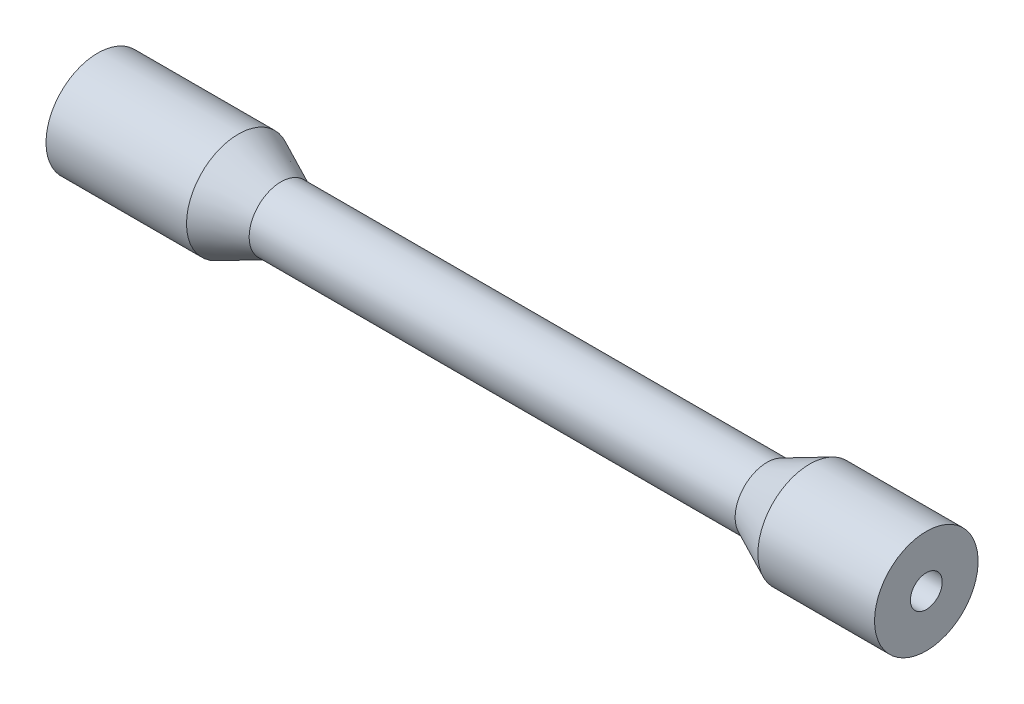
ISO-10303-21;
HEADER;
FILE_DESCRIPTION(('STEP AP214'),'2;1');
FILE_NAME('part.step','',(''),(''),'','','');
FILE_SCHEMA(('AUTOMOTIVE_DESIGN { 1 0 10303 214 1 1 1 1 }'));
ENDSEC;
DATA;
#1=APPLICATION_CONTEXT('core data for automotive mechanical design processes');
#2=APPLICATION_PROTOCOL_DEFINITION('international standard','automotive_design',2000,#1);
#3=PRODUCT_CONTEXT('',#1,'mechanical');
#4=PRODUCT('Part','Part','',(#3));
#5=PRODUCT_RELATED_PRODUCT_CATEGORY('part','',(#4));
#6=PRODUCT_DEFINITION_FORMATION('','',#4);
#7=PRODUCT_DEFINITION_CONTEXT('part definition',#1,'design');
#8=PRODUCT_DEFINITION('design','',#6,#7);
#9=PRODUCT_DEFINITION_SHAPE('','',#8);
#10=(LENGTH_UNIT() NAMED_UNIT(*) SI_UNIT(.MILLI.,.METRE.));
#11=(NAMED_UNIT(*) PLANE_ANGLE_UNIT() SI_UNIT($,.RADIAN.));
#12=(NAMED_UNIT(*) SI_UNIT($,.STERADIAN.) SOLID_ANGLE_UNIT());
#13=UNCERTAINTY_MEASURE_WITH_UNIT(LENGTH_MEASURE(1.E-05),#10,'distance_accuracy_value','');
#14=(GEOMETRIC_REPRESENTATION_CONTEXT(3) GLOBAL_UNCERTAINTY_ASSIGNED_CONTEXT((#13)) GLOBAL_UNIT_ASSIGNED_CONTEXT((#10,
#11,#12)) REPRESENTATION_CONTEXT('',''));
#15=CARTESIAN_POINT('',(0.,0.,0.));
#16=DIRECTION('',(0.,0.,1.));
#17=DIRECTION('',(1.,0.,0.));
#18=AXIS2_PLACEMENT_3D('',#15,#16,#17);
#19=CARTESIAN_POINT('',(52.,0.,0.));
#20=DIRECTION('',(-1.,0.,0.));
#21=DIRECTION('',(0.,0.,1.));
#22=AXIS2_PLACEMENT_3D('',#19,#20,#21);
#23=CYLINDRICAL_SURFACE('',#22,3.25);
#24=CARTESIAN_POINT('',(0.,0.,0.));
#25=DIRECTION('',(1.,0.,0.));
#26=DIRECTION('',(0.,0.,-1.));
#27=AXIS2_PLACEMENT_3D('',#24,#25,#26);
#28=CIRCLE('',#27,3.25);
#29=CARTESIAN_POINT('',(0.,0.,3.25));
#30=VERTEX_POINT('',#29);
#31=EDGE_CURVE('E46',#30,#30,#28,.T.);
#32=CARTESIAN_POINT('',(8.81936634936306,0.,0.));
#33=DIRECTION('',(-1.,0.,0.));
#34=DIRECTION('',(0.,0.,1.));
#35=AXIS2_PLACEMENT_3D('',#32,#33,#34);
#36=CIRCLE('',#35,3.25);
#37=CARTESIAN_POINT('',(8.81936634936306,0.,3.25));
#38=VERTEX_POINT('',#37);
#39=EDGE_CURVE('E61',#38,#38,#36,.T.);
#40=CARTESIAN_POINT('',(0.,0.,3.25));
#41=CARTESIAN_POINT('',(0.091868399472531,0.,3.25));
#42=CARTESIAN_POINT('',(0.183736798945062,0.,3.25));
#43=CARTESIAN_POINT('',(0.367473597890126,0.,3.25));
#44=CARTESIAN_POINT('',(0.45934199736266,0.,3.25));
#45=CARTESIAN_POINT('',(0.643078796307724,0.,3.25));
#46=CARTESIAN_POINT('',(0.734947195780255,0.,3.25));
#47=CARTESIAN_POINT('',(0.918683994725319,0.,3.25));
#48=CARTESIAN_POINT('',(1.01055239419785,0.,3.25));
#49=CARTESIAN_POINT('',(1.19428919314292,0.,3.25));
#50=CARTESIAN_POINT('',(1.28615759261545,0.,3.25));
#51=CARTESIAN_POINT('',(1.46989439156051,0.,3.25));
#52=CARTESIAN_POINT('',(1.56176279103304,0.,3.25));
#53=CARTESIAN_POINT('',(1.74549958997811,0.,3.25));
#54=CARTESIAN_POINT('',(1.83736798945064,0.,3.25));
#55=CARTESIAN_POINT('',(2.0211047883957,0.,3.25));
#56=CARTESIAN_POINT('',(2.11297318786823,0.,3.25));
#57=CARTESIAN_POINT('',(2.2967099868133,0.,3.25));
#58=CARTESIAN_POINT('',(2.38857838628583,0.,3.25));
#59=CARTESIAN_POINT('',(2.57231518523089,0.,3.25));
#60=CARTESIAN_POINT('',(2.66418358470343,0.,3.25));
#61=CARTESIAN_POINT('',(2.84792038364849,0.,3.25));
#62=CARTESIAN_POINT('',(2.93978878312102,0.,3.25));
#63=CARTESIAN_POINT('',(3.12352558206608,0.,3.25));
#64=CARTESIAN_POINT('',(3.21539398153861,0.,3.25));
#65=CARTESIAN_POINT('',(3.39913078048368,0.,3.25));
#66=CARTESIAN_POINT('',(3.49099917995621,0.,3.25));
#67=CARTESIAN_POINT('',(3.67473597890128,0.,3.25));
#68=CARTESIAN_POINT('',(3.76660437837381,0.,3.25));
#69=CARTESIAN_POINT('',(3.95034117731887,0.,3.25));
#70=CARTESIAN_POINT('',(4.0422095767914,0.,3.25));
#71=CARTESIAN_POINT('',(4.22594637573647,0.,3.25));
#72=CARTESIAN_POINT('',(4.317814775209,0.,3.25));
#73=CARTESIAN_POINT('',(4.50155157415406,0.,3.25));
#74=CARTESIAN_POINT('',(4.59341997362659,0.,3.25));
#75=CARTESIAN_POINT('',(4.77715677257166,0.,3.25));
#76=CARTESIAN_POINT('',(4.86902517204419,0.,3.25));
#77=CARTESIAN_POINT('',(5.05276197098925,0.,3.25));
#78=CARTESIAN_POINT('',(5.14463037046179,0.,3.25));
#79=CARTESIAN_POINT('',(5.32836716940685,0.,3.25));
#80=CARTESIAN_POINT('',(5.42023556887938,0.,3.25));
#81=CARTESIAN_POINT('',(5.60397236782445,0.,3.25));
#82=CARTESIAN_POINT('',(5.69584076729698,0.,3.25));
#83=CARTESIAN_POINT('',(5.87957756624204,0.,3.25));
#84=CARTESIAN_POINT('',(5.97144596571457,0.,3.25));
#85=CARTESIAN_POINT('',(6.15518276465964,0.,3.25));
#86=CARTESIAN_POINT('',(6.24705116413217,0.,3.25));
#87=CARTESIAN_POINT('',(6.43078796307723,0.,3.25));
#88=CARTESIAN_POINT('',(6.52265636254976,0.,3.25));
#89=CARTESIAN_POINT('',(6.70639316149483,0.,3.25));
#90=CARTESIAN_POINT('',(6.79826156096736,0.,3.25));
#91=CARTESIAN_POINT('',(6.98199835991242,0.,3.25));
#92=CARTESIAN_POINT('',(7.07386675938496,0.,3.25));
#93=CARTESIAN_POINT('',(7.25760355833002,0.,3.25));
#94=CARTESIAN_POINT('',(7.34947195780255,0.,3.25));
#95=CARTESIAN_POINT('',(7.53320875674761,0.,3.25));
#96=CARTESIAN_POINT('',(7.62507715622014,0.,3.25));
#97=CARTESIAN_POINT('',(7.80881395516521,0.,3.25));
#98=CARTESIAN_POINT('',(7.90068235463774,0.,3.25));
#99=CARTESIAN_POINT('',(8.08441915358281,0.,3.25));
#100=CARTESIAN_POINT('',(8.17628755305534,0.,3.25));
#101=CARTESIAN_POINT('',(8.3600243520004,0.,3.25));
#102=CARTESIAN_POINT('',(8.45189275147293,0.,3.25));
#103=CARTESIAN_POINT('',(8.635629550418,0.,3.25));
#104=CARTESIAN_POINT('',(8.72749794989053,0.,3.25));
#105=CARTESIAN_POINT('',(8.81936634936306,0.,3.25));
#106=B_SPLINE_CURVE_WITH_KNOTS('',3,(#40,#41,#42,#43,#44,#45,#46,#47,#48,#49,#50,#51,#52,#53,
#54,#55,#56,#57,#58,#59,#60,#61,#62,#63,#64,#65,#66,#67,#68,#69,#70,#71,#72,#73,#74,#75,#76,#77,
#78,#79,#80,#81,#82,#83,#84,#85,#86,#87,#88,#89,#90,#91,#92,#93,#94,#95,#96,#97,#98,#99,#100,
#101,#102,#103,#104,#105),.UNSPECIFIED.,.F.,.F.,(4,2,2,2,2,2,2,2,2,2,2,2,2,2,2,2,2,2,2,2,2,2,2,
2,2,2,2,2,2,2,2,2,4),(0.,0.275605198417593,0.551210396835193,0.826815595252786,1.10242079367039,
1.37802599208798,1.65363119050557,1.92923638892317,2.20484158734077,2.48044678575836,
2.75605198417596,3.03165718259355,3.30726238101114,3.58286757942874,3.85847277784634,
4.13407797626394,4.40968317468153,4.68528837309912,4.96089357151672,5.23649876993432,
5.51210396835192,5.78770916676951,6.0633143651871,6.3389195636047,6.6145247620223,
6.89012996043989,7.16573515885749,7.44134035727508,7.71694555569267,7.99255075411028,
8.26815595252787,8.54376115094546,8.81936634936306),.UNSPECIFIED.);
#107=EDGE_CURVE('BSEAM43',#30,#38,#106,.T.);
#108=ORIENTED_EDGE('',*,*,#31,.T.);
#109=ORIENTED_EDGE('',*,*,#39,.T.);
#110=ORIENTED_EDGE('',*,*,#107,.T.);
#111=ORIENTED_EDGE('',*,*,#107,.F.);
#112=EDGE_LOOP('',(#108,#110,#109,#111));
#113=FACE_BOUND('',#112,.T.);
#114=ADVANCED_FACE('F43',(#113),#23,.T.);
#115=CARTESIAN_POINT('',(52.,0.,0.));
#116=DIRECTION('',(1.,0.,0.));
#117=DIRECTION('',(0.,0.,-1.));
#118=AXIS2_PLACEMENT_3D('',#115,#116,#117);
#119=CIRCLE('',#118,3.25);
#120=CARTESIAN_POINT('',(52.,0.,3.25));
#121=VERTEX_POINT('',#120);
#122=EDGE_CURVE('E10',#121,#121,#119,.T.);
#123=CARTESIAN_POINT('',(44.6806336506369,0.,0.));
#124=DIRECTION('',(-1.,0.,0.));
#125=DIRECTION('',(0.,0.,1.));
#126=AXIS2_PLACEMENT_3D('',#123,#124,#125);
#127=CIRCLE('',#126,3.25);
#128=CARTESIAN_POINT('',(44.6806336506369,0.,3.25));
#129=VERTEX_POINT('',#128);
#130=EDGE_CURVE('E76',#129,#129,#127,.T.);
#131=CARTESIAN_POINT('',(52.,0.,3.25));
#132=CARTESIAN_POINT('',(51.9237566005275,0.,3.25));
#133=CARTESIAN_POINT('',(51.8475132010549,0.,3.25));
#134=CARTESIAN_POINT('',(51.6950264021099,0.,3.25));
#135=CARTESIAN_POINT('',(51.6187830026373,0.,3.25));
#136=CARTESIAN_POINT('',(51.4662962036923,0.,3.25));
#137=CARTESIAN_POINT('',(51.3900528042197,0.,3.25));
#138=CARTESIAN_POINT('',(51.2375660052747,0.,3.25));
#139=CARTESIAN_POINT('',(51.1613226058021,0.,3.25));
#140=CARTESIAN_POINT('',(51.0088358068571,0.,3.25));
#141=CARTESIAN_POINT('',(50.9325924073845,0.,3.25));
#142=CARTESIAN_POINT('',(50.7801056084395,0.,3.25));
#143=CARTESIAN_POINT('',(50.703862208967,0.,3.25));
#144=CARTESIAN_POINT('',(50.5513754100219,0.,3.25));
#145=CARTESIAN_POINT('',(50.4751320105494,0.,3.25));
#146=CARTESIAN_POINT('',(50.3226452116043,0.,3.25));
#147=CARTESIAN_POINT('',(50.2464018121318,0.,3.25));
#148=CARTESIAN_POINT('',(50.0939150131867,0.,3.25));
#149=CARTESIAN_POINT('',(50.0176716137142,0.,3.25));
#150=CARTESIAN_POINT('',(49.8651848147691,0.,3.25));
#151=CARTESIAN_POINT('',(49.7889414152966,0.,3.25));
#152=CARTESIAN_POINT('',(49.6364546163515,0.,3.25));
#153=CARTESIAN_POINT('',(49.560211216879,0.,3.25));
#154=CARTESIAN_POINT('',(49.4077244179339,0.,3.25));
#155=CARTESIAN_POINT('',(49.3314810184614,0.,3.25));
#156=CARTESIAN_POINT('',(49.1789942195163,0.,3.25));
#157=CARTESIAN_POINT('',(49.1027508200438,0.,3.25));
#158=CARTESIAN_POINT('',(48.9502640210987,0.,3.25));
#159=CARTESIAN_POINT('',(48.8740206216262,0.,3.25));
#160=CARTESIAN_POINT('',(48.7215338226811,0.,3.25));
#161=CARTESIAN_POINT('',(48.6452904232086,0.,3.25));
#162=CARTESIAN_POINT('',(48.4928036242635,0.,3.25));
#163=CARTESIAN_POINT('',(48.416560224791,0.,3.25));
#164=CARTESIAN_POINT('',(48.2640734258459,0.,3.25));
#165=CARTESIAN_POINT('',(48.1878300263734,0.,3.25));
#166=CARTESIAN_POINT('',(48.0353432274283,0.,3.25));
#167=CARTESIAN_POINT('',(47.9590998279558,0.,3.25));
#168=CARTESIAN_POINT('',(47.8066130290107,0.,3.25));
#169=CARTESIAN_POINT('',(47.7303696295382,0.,3.25));
#170=CARTESIAN_POINT('',(47.5778828305931,0.,3.25));
#171=CARTESIAN_POINT('',(47.5016394311206,0.,3.25));
#172=CARTESIAN_POINT('',(47.3491526321755,0.,3.25));
#173=CARTESIAN_POINT('',(47.272909232703,0.,3.25));
#174=CARTESIAN_POINT('',(47.120422433758,0.,3.25));
#175=CARTESIAN_POINT('',(47.0441790342854,0.,3.25));
#176=CARTESIAN_POINT('',(46.8916922353404,0.,3.25));
#177=CARTESIAN_POINT('',(46.8154488358678,0.,3.25));
#178=CARTESIAN_POINT('',(46.6629620369228,0.,3.25));
#179=CARTESIAN_POINT('',(46.5867186374502,0.,3.25));
#180=CARTESIAN_POINT('',(46.4342318385052,0.,3.25));
#181=CARTESIAN_POINT('',(46.3579884390326,0.,3.25));
#182=CARTESIAN_POINT('',(46.2055016400876,0.,3.25));
#183=CARTESIAN_POINT('',(46.129258240615,0.,3.25));
#184=CARTESIAN_POINT('',(45.97677144167,0.,3.25));
#185=CARTESIAN_POINT('',(45.9005280421974,0.,3.25));
#186=CARTESIAN_POINT('',(45.7480412432524,0.,3.25));
#187=CARTESIAN_POINT('',(45.6717978437798,0.,3.25));
#188=CARTESIAN_POINT('',(45.5193110448348,0.,3.25));
#189=CARTESIAN_POINT('',(45.4430676453623,0.,3.25));
#190=CARTESIAN_POINT('',(45.2905808464172,0.,3.25));
#191=CARTESIAN_POINT('',(45.2143374469447,0.,3.25));
#192=CARTESIAN_POINT('',(45.0618506479996,0.,3.25));
#193=CARTESIAN_POINT('',(44.9856072485271,0.,3.25));
#194=CARTESIAN_POINT('',(44.833120449582,0.,3.25));
#195=CARTESIAN_POINT('',(44.7568770501095,0.,3.25));
#196=CARTESIAN_POINT('',(44.6806336506369,0.,3.25));
#197=B_SPLINE_CURVE_WITH_KNOTS('',3,(#131,#132,#133,#134,#135,#136,#137,#138,#139,#140,#141,
#142,#143,#144,#145,#146,#147,#148,#149,#150,#151,#152,#153,#154,#155,#156,#157,#158,#159,#160,
#161,#162,#163,#164,#165,#166,#167,#168,#169,#170,#171,#172,#173,#174,#175,#176,#177,#178,#179,
#180,#181,#182,#183,#184,#185,#186,#187,#188,#189,#190,#191,#192,#193,#194,#195,#196),
.UNSPECIFIED.,.F.,.F.,(4,2,2,2,2,2,2,2,2,2,2,2,2,2,2,2,2,2,2,2,2,2,2,2,2,2,2,2,2,2,2,2,4),(0.,
0.228730198417598,0.457460396835196,0.686190595252788,0.914920793670386,1.14365099208798,
1.37238119050558,1.60111138892317,1.82984158734076,2.05857178575836,2.28730198417596,
2.51603218259355,2.74476238101115,2.97349257942875,3.20222277784634,3.43095297626394,
3.65968317468153,3.88841337309913,4.11714357151673,4.34587376993432,4.57460396835192,
4.80333416676951,5.03206436518711,5.2607945636047,5.4895247620223,5.71825496043989,
5.94698515885749,6.17571535727508,6.40444555569268,6.63317575411027,6.86190595252787,
7.09063615094547,7.31936634936306),.UNSPECIFIED.);
#198=EDGE_CURVE('BSEAM84',#121,#129,#197,.T.);
#199=ORIENTED_EDGE('',*,*,#122,.F.);
#200=ORIENTED_EDGE('',*,*,#130,.F.);
#201=ORIENTED_EDGE('',*,*,#198,.T.);
#202=ORIENTED_EDGE('',*,*,#198,.F.);
#203=EDGE_LOOP('',(#199,#201,#200,#202));
#204=FACE_BOUND('',#203,.T.);
#205=ADVANCED_FACE('F84',(#204),#23,.T.);
#206=CARTESIAN_POINT('',(52.,0.,0.));
#207=DIRECTION('',(1.,0.,0.));
#208=DIRECTION('',(0.,0.,-1.));
#209=AXIS2_PLACEMENT_3D('',#206,#207,#208);
#210=PLANE('',#209);
#211=ORIENTED_EDGE('',*,*,#122,.T.);
#212=EDGE_LOOP('',(#211));
#213=FACE_BOUND('',#212,.T.);
#214=CARTESIAN_POINT('',(52.,0.,0.));
#215=DIRECTION('',(1.,0.,0.));
#216=DIRECTION('',(0.,0.,-1.));
#217=AXIS2_PLACEMENT_3D('',#214,#215,#216);
#218=CIRCLE('',#217,1.);
#219=CARTESIAN_POINT('',(52.,0.,1.));
#220=VERTEX_POINT('',#219);
#221=EDGE_CURVE('E55',#220,#220,#218,.T.);
#222=ORIENTED_EDGE('',*,*,#221,.F.);
#223=EDGE_LOOP('',(#222));
#224=FACE_BOUND('',#223,.T.);
#225=ADVANCED_FACE('F86',(#213,#224),#210,.T.);
#226=CARTESIAN_POINT('',(0.,0.,0.));
#227=DIRECTION('',(1.,0.,0.));
#228=DIRECTION('',(0.,0.,-1.));
#229=AXIS2_PLACEMENT_3D('',#226,#227,#228);
#230=PLANE('',#229);
#231=ORIENTED_EDGE('',*,*,#31,.F.);
#232=EDGE_LOOP('',(#231));
#233=FACE_BOUND('',#232,.T.);
#234=CARTESIAN_POINT('',(0.,0.,0.));
#235=DIRECTION('',(1.,0.,0.));
#236=DIRECTION('',(0.,0.,-1.));
#237=AXIS2_PLACEMENT_3D('',#234,#235,#236);
#238=CIRCLE('',#237,1.);
#239=CARTESIAN_POINT('',(0.,0.,1.));
#240=VERTEX_POINT('',#239);
#241=EDGE_CURVE('E57',#240,#240,#238,.T.);
#242=ORIENTED_EDGE('',*,*,#241,.T.);
#243=EDGE_LOOP('',(#242));
#244=FACE_BOUND('',#243,.T.);
#245=ADVANCED_FACE('F93',(#233,#244),#230,.F.);
#246=CARTESIAN_POINT('',(52.,0.,0.));
#247=DIRECTION('',(-1.,0.,0.));
#248=DIRECTION('',(0.,0.,1.));
#249=AXIS2_PLACEMENT_3D('',#246,#247,#248);
#250=CYLINDRICAL_SURFACE('',#249,1.);
#251=CARTESIAN_POINT('',(52.,0.,1.));
#252=CARTESIAN_POINT('',(51.4583333333333,0.,1.));
#253=CARTESIAN_POINT('',(50.9166666666667,0.,1.));
#254=CARTESIAN_POINT('',(49.8333333333333,0.,1.));
#255=CARTESIAN_POINT('',(49.2916666666667,0.,1.));
#256=CARTESIAN_POINT('',(48.2083333333333,0.,1.));
#257=CARTESIAN_POINT('',(47.6666666666667,0.,1.));
#258=CARTESIAN_POINT('',(46.5833333333333,0.,1.));
#259=CARTESIAN_POINT('',(46.0416666666667,0.,1.));
#260=CARTESIAN_POINT('',(44.9583333333333,0.,1.));
#261=CARTESIAN_POINT('',(44.4166666666667,0.,1.));
#262=CARTESIAN_POINT('',(43.3333333333333,0.,1.));
#263=CARTESIAN_POINT('',(42.7916666666667,0.,1.));
#264=CARTESIAN_POINT('',(41.7083333333333,0.,1.));
#265=CARTESIAN_POINT('',(41.1666666666667,0.,1.));
#266=CARTESIAN_POINT('',(40.0833333333333,0.,1.));
#267=CARTESIAN_POINT('',(39.5416666666667,0.,1.));
#268=CARTESIAN_POINT('',(38.4583333333333,0.,1.));
#269=CARTESIAN_POINT('',(37.9166666666667,0.,1.));
#270=CARTESIAN_POINT('',(36.8333333333333,0.,1.));
#271=CARTESIAN_POINT('',(36.2916666666667,0.,1.));
#272=CARTESIAN_POINT('',(35.2083333333333,0.,1.));
#273=CARTESIAN_POINT('',(34.6666666666667,0.,1.));
#274=CARTESIAN_POINT('',(33.5833333333333,0.,1.));
#275=CARTESIAN_POINT('',(33.0416666666667,0.,1.));
#276=CARTESIAN_POINT('',(31.9583333333333,0.,1.));
#277=CARTESIAN_POINT('',(31.4166666666667,0.,1.));
#278=CARTESIAN_POINT('',(30.3333333333333,0.,1.));
#279=CARTESIAN_POINT('',(29.7916666666667,0.,1.));
#280=CARTESIAN_POINT('',(28.7083333333333,0.,1.));
#281=CARTESIAN_POINT('',(28.1666666666667,0.,1.));
#282=CARTESIAN_POINT('',(27.0833333333333,0.,1.));
#283=CARTESIAN_POINT('',(26.5416666666667,0.,1.));
#284=CARTESIAN_POINT('',(25.4583333333333,0.,1.));
#285=CARTESIAN_POINT('',(24.9166666666667,0.,1.));
#286=CARTESIAN_POINT('',(23.8333333333333,0.,1.));
#287=CARTESIAN_POINT('',(23.2916666666667,0.,1.));
#288=CARTESIAN_POINT('',(22.2083333333333,0.,1.));
#289=CARTESIAN_POINT('',(21.6666666666667,0.,1.));
#290=CARTESIAN_POINT('',(20.5833333333333,0.,1.));
#291=CARTESIAN_POINT('',(20.0416666666667,0.,1.));
#292=CARTESIAN_POINT('',(18.9583333333333,0.,1.));
#293=CARTESIAN_POINT('',(18.4166666666667,0.,1.));
#294=CARTESIAN_POINT('',(17.3333333333333,0.,1.));
#295=CARTESIAN_POINT('',(16.7916666666667,0.,1.));
#296=CARTESIAN_POINT('',(15.7083333333333,0.,1.));
#297=CARTESIAN_POINT('',(15.1666666666667,0.,1.));
#298=CARTESIAN_POINT('',(14.0833333333333,0.,1.));
#299=CARTESIAN_POINT('',(13.5416666666667,0.,1.));
#300=CARTESIAN_POINT('',(12.4583333333333,0.,1.));
#301=CARTESIAN_POINT('',(11.9166666666667,0.,1.));
#302=CARTESIAN_POINT('',(10.8333333333333,0.,1.));
#303=CARTESIAN_POINT('',(10.2916666666667,0.,1.));
#304=CARTESIAN_POINT('',(9.20833333333333,0.,1.));
#305=CARTESIAN_POINT('',(8.66666666666667,0.,1.));
#306=CARTESIAN_POINT('',(7.58333333333333,0.,1.));
#307=CARTESIAN_POINT('',(7.04166666666667,0.,1.));
#308=CARTESIAN_POINT('',(5.95833333333333,0.,1.));
#309=CARTESIAN_POINT('',(5.41666666666667,0.,1.));
#310=CARTESIAN_POINT('',(4.33333333333333,0.,1.));
#311=CARTESIAN_POINT('',(3.79166666666667,0.,1.));
#312=CARTESIAN_POINT('',(2.70833333333334,0.,1.));
#313=CARTESIAN_POINT('',(2.16666666666667,0.,1.));
#314=CARTESIAN_POINT('',(1.08333333333333,0.,1.));
#315=CARTESIAN_POINT('',(0.541666666666667,0.,1.));
#316=CARTESIAN_POINT('',(0.,0.,1.));
#317=B_SPLINE_CURVE_WITH_KNOTS('',3,(#251,#252,#253,#254,#255,#256,#257,#258,#259,#260,#261,
#262,#263,#264,#265,#266,#267,#268,#269,#270,#271,#272,#273,#274,#275,#276,#277,#278,#279,#280,
#281,#282,#283,#284,#285,#286,#287,#288,#289,#290,#291,#292,#293,#294,#295,#296,#297,#298,#299,
#300,#301,#302,#303,#304,#305,#306,#307,#308,#309,#310,#311,#312,#313,#314,#315,#316),
.UNSPECIFIED.,.F.,.F.,(4,2,2,2,2,2,2,2,2,2,2,2,2,2,2,2,2,2,2,2,2,2,2,2,2,2,2,2,2,2,2,2,4),(0.,
1.625,3.25,4.875,6.50000000000001,8.125,9.75,11.375,13.,14.625,16.25,17.875,19.5,21.125,22.75,
24.375,26.,27.625,29.25,30.875,32.5,34.125,35.75,37.375,39.,40.625,42.25,43.875,45.5,47.125,
48.75,50.375,52.),.UNSPECIFIED.);
#318=EDGE_CURVE('BSEAM105',#220,#240,#317,.T.);
#319=ORIENTED_EDGE('',*,*,#221,.T.);
#320=ORIENTED_EDGE('',*,*,#241,.F.);
#321=ORIENTED_EDGE('',*,*,#318,.T.);
#322=ORIENTED_EDGE('',*,*,#318,.F.);
#323=EDGE_LOOP('',(#319,#321,#320,#322));
#324=FACE_BOUND('',#323,.T.);
#325=ADVANCED_FACE('F105',(#324),#250,.F.);
#326=CARTESIAN_POINT('',(8.81936634936306,0.,0.));
#327=DIRECTION('',(-1.,0.,0.));
#328=DIRECTION('',(0.,0.,1.));
#329=AXIS2_PLACEMENT_3D('',#326,#327,#328);
#330=CONICAL_SURFACE('',#329,3.25,0.436332312998584);
#331=CARTESIAN_POINT('',(11.5,0.,0.));
#332=DIRECTION('',(-1.,0.,0.));
#333=DIRECTION('',(0.,0.,1.));
#334=AXIS2_PLACEMENT_3D('',#331,#332,#333);
#335=CIRCLE('',#334,2.);
#336=CARTESIAN_POINT('',(11.5,0.,2.));
#337=VERTEX_POINT('',#336);
#338=EDGE_CURVE('E68',#337,#337,#335,.T.);
#339=ORIENTED_EDGE('',*,*,#338,.T.);
#340=EDGE_LOOP('',(#339));
#341=FACE_BOUND('',#340,.T.);
#342=ORIENTED_EDGE('',*,*,#39,.F.);
#343=EDGE_LOOP('',(#342));
#344=FACE_BOUND('',#343,.T.);
#345=ADVANCED_FACE('F103',(#341,#344),#330,.T.);
#346=CARTESIAN_POINT('',(0.,0.,0.));
#347=DIRECTION('',(-1.,0.,0.));
#348=DIRECTION('',(0.,0.,1.));
#349=AXIS2_PLACEMENT_3D('',#346,#347,#348);
#350=CYLINDRICAL_SURFACE('',#349,2.);
#351=CARTESIAN_POINT('',(42.,0.,0.));
#352=DIRECTION('',(-1.,0.,0.));
#353=DIRECTION('',(0.,0.,1.));
#354=AXIS2_PLACEMENT_3D('',#351,#352,#353);
#355=CIRCLE('',#354,2.);
#356=CARTESIAN_POINT('',(42.,0.,2.));
#357=VERTEX_POINT('',#356);
#358=EDGE_CURVE('E72',#357,#357,#355,.T.);
#359=ORIENTED_EDGE('',*,*,#358,.T.);
#360=EDGE_LOOP('',(#359));
#361=FACE_BOUND('',#360,.T.);
#362=ORIENTED_EDGE('',*,*,#338,.F.);
#363=EDGE_LOOP('',(#362));
#364=FACE_BOUND('',#363,.T.);
#365=ADVANCED_FACE('F104',(#361,#364),#350,.T.);
#366=CARTESIAN_POINT('',(42.,0.,0.));
#367=DIRECTION('',(1.,0.,0.));
#368=DIRECTION('',(0.,0.,-1.));
#369=AXIS2_PLACEMENT_3D('',#366,#367,#368);
#370=CONICAL_SURFACE('',#369,2.,0.436332312998584);
#371=ORIENTED_EDGE('',*,*,#130,.T.);
#372=EDGE_LOOP('',(#371));
#373=FACE_BOUND('',#372,.T.);
#374=ORIENTED_EDGE('',*,*,#358,.F.);
#375=EDGE_LOOP('',(#374));
#376=FACE_BOUND('',#375,.T.);
#377=ADVANCED_FACE('F81',(#373,#376),#370,.T.);
#378=CLOSED_SHELL('',(#114,#205,#225,#245,#325,#345,#365,#377));
#379=MANIFOLD_SOLID_BREP('B2',#378);
#380=ADVANCED_BREP_SHAPE_REPRESENTATION('',(#18,#379),#14);
#381=SHAPE_DEFINITION_REPRESENTATION(#9,#380);
ENDSEC;
END-ISO-10303-21;
